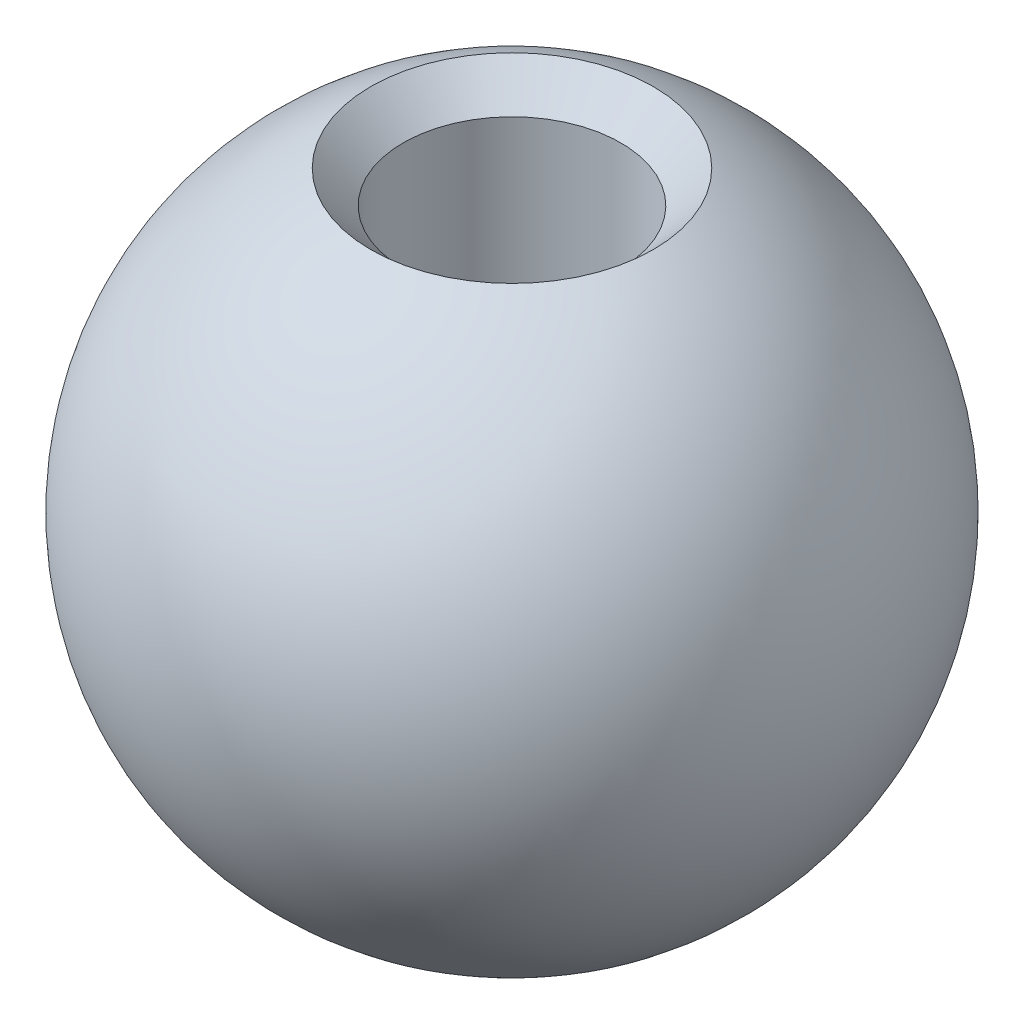
ISO-10303-21;
HEADER;
FILE_DESCRIPTION(('STEP AP214'),'2;1');
FILE_NAME('part.step','',(''),(''),'','','');
FILE_SCHEMA(('AUTOMOTIVE_DESIGN { 1 0 10303 214 1 1 1 1 }'));
ENDSEC;
DATA;
#1=APPLICATION_CONTEXT('core data for automotive mechanical design processes');
#2=APPLICATION_PROTOCOL_DEFINITION('international standard','automotive_design',2000,#1);
#3=PRODUCT_CONTEXT('',#1,'mechanical');
#4=PRODUCT('Part','Part','',(#3));
#5=PRODUCT_RELATED_PRODUCT_CATEGORY('part','',(#4));
#6=PRODUCT_DEFINITION_FORMATION('','',#4);
#7=PRODUCT_DEFINITION_CONTEXT('part definition',#1,'design');
#8=PRODUCT_DEFINITION('design','',#6,#7);
#9=PRODUCT_DEFINITION_SHAPE('','',#8);
#10=(LENGTH_UNIT() NAMED_UNIT(*) SI_UNIT(.MILLI.,.METRE.));
#11=(NAMED_UNIT(*) PLANE_ANGLE_UNIT() SI_UNIT($,.RADIAN.));
#12=(NAMED_UNIT(*) SI_UNIT($,.STERADIAN.) SOLID_ANGLE_UNIT());
#13=UNCERTAINTY_MEASURE_WITH_UNIT(LENGTH_MEASURE(1.E-05),#10,'distance_accuracy_value','');
#14=(GEOMETRIC_REPRESENTATION_CONTEXT(3) GLOBAL_UNCERTAINTY_ASSIGNED_CONTEXT((#13)) GLOBAL_UNIT_ASSIGNED_CONTEXT((#10,
#11,#12)) REPRESENTATION_CONTEXT('',''));
#15=CARTESIAN_POINT('',(0.,0.,0.));
#16=DIRECTION('',(0.,0.,1.));
#17=DIRECTION('',(1.,0.,0.));
#18=AXIS2_PLACEMENT_3D('',#15,#16,#17);
#19=CARTESIAN_POINT('',(0.,0.,0.));
#20=DIRECTION('',(0.,-1.,0.));
#21=DIRECTION('',(-1.,0.,0.));
#22=AXIS2_PLACEMENT_3D('',#19,#20,#21);
#23=SPHERICAL_SURFACE('',#22,5.);
#24=CARTESIAN_POINT('',(0.,4.5176417011893,0.));
#25=DIRECTION('',(0.,-1.,0.));
#26=DIRECTION('',(0.,0.,-1.));
#27=AXIS2_PLACEMENT_3D('',#24,#25,#26);
#28=CIRCLE('',#27,2.1426417011893);
#29=CARTESIAN_POINT('',(0.,4.5176417011893,-2.1426417011893));
#30=VERTEX_POINT('',#29);
#31=EDGE_CURVE('E11',#30,#30,#28,.F.);
#32=ORIENTED_EDGE('',*,*,#31,.F.);
#33=EDGE_LOOP('',(#32));
#34=FACE_BOUND('',#33,.T.);
#35=ADVANCED_FACE('F39',(#34),#23,.T.);
#36=CARTESIAN_POINT('',(0.,-2.,0.));
#37=DIRECTION('',(0.,1.,0.));
#38=DIRECTION('',(0.,0.,1.));
#39=AXIS2_PLACEMENT_3D('',#36,#37,#38);
#40=CONICAL_SURFACE('',#39,1.65,1.02974425867665);
#41=CARTESIAN_POINT('',(0.,-2.99142002139547,0.));
#42=VERTEX_POINT('',#41);
#43=VERTEX_LOOP('',#42);
#44=FACE_BOUND('',#43,.T.);
#45=CARTESIAN_POINT('',(0.,-2.,0.));
#46=DIRECTION('',(0.,1.,0.));
#47=DIRECTION('',(0.,0.,1.));
#48=AXIS2_PLACEMENT_3D('',#45,#46,#47);
#49=CIRCLE('',#48,1.65);
#50=CARTESIAN_POINT('',(0.,-2.,1.65));
#51=VERTEX_POINT('',#50);
#52=EDGE_CURVE('E45',#51,#51,#49,.T.);
#53=ORIENTED_EDGE('',*,*,#52,.T.);
#54=EDGE_LOOP('',(#53));
#55=FACE_BOUND('',#54,.T.);
#56=ADVANCED_FACE('F48',(#44,#55),#40,.F.);
#57=CARTESIAN_POINT('',(0.,5.,0.));
#58=DIRECTION('',(0.,1.,0.));
#59=DIRECTION('',(0.,0.,1.));
#60=AXIS2_PLACEMENT_3D('',#57,#58,#59);
#61=CYLINDRICAL_SURFACE('',#60,1.65);
#62=ORIENTED_EDGE('',*,*,#52,.F.);
#63=EDGE_LOOP('',(#62));
#64=FACE_BOUND('',#63,.T.);
#65=CARTESIAN_POINT('',(0.,4.025,0.));
#66=DIRECTION('',(0.,1.,0.));
#67=DIRECTION('',(0.,0.,1.));
#68=AXIS2_PLACEMENT_3D('',#65,#66,#67);
#69=CIRCLE('',#68,1.65);
#70=CARTESIAN_POINT('',(0.,4.025,1.65));
#71=VERTEX_POINT('',#70);
#72=EDGE_CURVE('E55',#71,#71,#69,.T.);
#73=ORIENTED_EDGE('',*,*,#72,.T.);
#74=EDGE_LOOP('',(#73));
#75=FACE_BOUND('',#74,.T.);
#76=ADVANCED_FACE('F51',(#64,#75),#61,.F.);
#77=CARTESIAN_POINT('',(0.,5.,0.));
#78=DIRECTION('',(0.,1.,0.));
#79=DIRECTION('',(0.,0.,1.));
#80=AXIS2_PLACEMENT_3D('',#77,#78,#79);
#81=CONICAL_SURFACE('',#80,2.625,0.785398163397449);
#82=ORIENTED_EDGE('',*,*,#31,.T.);
#83=EDGE_LOOP('',(#82));
#84=FACE_BOUND('',#83,.T.);
#85=ORIENTED_EDGE('',*,*,#72,.F.);
#86=EDGE_LOOP('',(#85));
#87=FACE_BOUND('',#86,.T.);
#88=ADVANCED_FACE('F61',(#84,#87),#81,.F.);
#89=CLOSED_SHELL('',(#35,#56,#76,#88));
#90=MANIFOLD_SOLID_BREP('B2',#89);
#91=ADVANCED_BREP_SHAPE_REPRESENTATION('',(#18,#90),#14);
#92=SHAPE_DEFINITION_REPRESENTATION(#9,#91);
ENDSEC;
END-ISO-10303-21;
